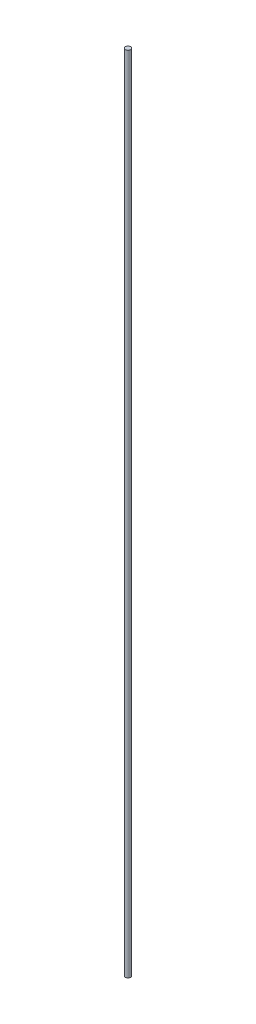
ISO-10303-21;
HEADER;
FILE_DESCRIPTION(('STEP AP214'),'2;1');
FILE_NAME('part.step','',(''),(''),'','','');
FILE_SCHEMA(('AUTOMOTIVE_DESIGN { 1 0 10303 214 1 1 1 1 }'));
ENDSEC;
DATA;
#1=APPLICATION_CONTEXT('core data for automotive mechanical design processes');
#2=APPLICATION_PROTOCOL_DEFINITION('international standard','automotive_design',2000,#1);
#3=PRODUCT_CONTEXT('',#1,'mechanical');
#4=PRODUCT('Part','Part','',(#3));
#5=PRODUCT_RELATED_PRODUCT_CATEGORY('part','',(#4));
#6=PRODUCT_DEFINITION_FORMATION('','',#4);
#7=PRODUCT_DEFINITION_CONTEXT('part definition',#1,'design');
#8=PRODUCT_DEFINITION('design','',#6,#7);
#9=PRODUCT_DEFINITION_SHAPE('','',#8);
#10=(LENGTH_UNIT() NAMED_UNIT(*) SI_UNIT(.MILLI.,.METRE.));
#11=(NAMED_UNIT(*) PLANE_ANGLE_UNIT() SI_UNIT($,.RADIAN.));
#12=(NAMED_UNIT(*) SI_UNIT($,.STERADIAN.) SOLID_ANGLE_UNIT());
#13=UNCERTAINTY_MEASURE_WITH_UNIT(LENGTH_MEASURE(1.E-05),#10,'distance_accuracy_value','');
#14=(GEOMETRIC_REPRESENTATION_CONTEXT(3) GLOBAL_UNCERTAINTY_ASSIGNED_CONTEXT((#13)) GLOBAL_UNIT_ASSIGNED_CONTEXT((#10,
#11,#12)) REPRESENTATION_CONTEXT('',''));
#15=CARTESIAN_POINT('',(0.,0.,0.));
#16=DIRECTION('',(0.,0.,1.));
#17=DIRECTION('',(1.,0.,0.));
#18=AXIS2_PLACEMENT_3D('',#15,#16,#17);
#19=CARTESIAN_POINT('',(0.,1219.2,0.));
#20=DIRECTION('',(0.,-1.,0.));
#21=DIRECTION('',(0.,0.,-1.));
#22=AXIS2_PLACEMENT_3D('',#19,#20,#21);
#23=CYLINDRICAL_SURFACE('',#22,3.96875);
#24=CARTESIAN_POINT('',(0.,1219.2,0.));
#25=DIRECTION('',(0.,1.,0.));
#26=DIRECTION('',(0.,0.,1.));
#27=AXIS2_PLACEMENT_3D('',#24,#25,#26);
#28=CIRCLE('',#27,3.96875);
#29=CARTESIAN_POINT('',(0.,1219.2,-3.96875));
#30=VERTEX_POINT('',#29);
#31=EDGE_CURVE('E12',#30,#30,#28,.T.);
#32=CARTESIAN_POINT('',(0.,0.,0.));
#33=DIRECTION('',(0.,1.,0.));
#34=DIRECTION('',(0.,0.,1.));
#35=AXIS2_PLACEMENT_3D('',#32,#33,#34);
#36=CIRCLE('',#35,3.96875);
#37=CARTESIAN_POINT('',(0.,0.,-3.96875));
#38=VERTEX_POINT('',#37);
#39=EDGE_CURVE('E43',#38,#38,#36,.T.);
#40=CARTESIAN_POINT('',(0.,1219.2,-3.96875));
#41=CARTESIAN_POINT('',(0.,1206.5,-3.96875));
#42=CARTESIAN_POINT('',(0.,1193.8,-3.96875));
#43=CARTESIAN_POINT('',(0.,1168.4,-3.96875));
#44=CARTESIAN_POINT('',(0.,1155.7,-3.96875));
#45=CARTESIAN_POINT('',(0.,1130.3,-3.96875));
#46=CARTESIAN_POINT('',(0.,1117.6,-3.96875));
#47=CARTESIAN_POINT('',(0.,1092.2,-3.96875));
#48=CARTESIAN_POINT('',(0.,1079.5,-3.96875));
#49=CARTESIAN_POINT('',(0.,1054.1,-3.96875));
#50=CARTESIAN_POINT('',(0.,1041.4,-3.96875));
#51=CARTESIAN_POINT('',(0.,1016.,-3.96875));
#52=CARTESIAN_POINT('',(0.,1003.3,-3.96875));
#53=CARTESIAN_POINT('',(0.,977.9,-3.96875));
#54=CARTESIAN_POINT('',(0.,965.2,-3.96875));
#55=CARTESIAN_POINT('',(0.,939.8,-3.96875));
#56=CARTESIAN_POINT('',(0.,927.1,-3.96875));
#57=CARTESIAN_POINT('',(0.,901.7,-3.96875));
#58=CARTESIAN_POINT('',(0.,889.,-3.96875));
#59=CARTESIAN_POINT('',(0.,863.6,-3.96875));
#60=CARTESIAN_POINT('',(0.,850.9,-3.96875));
#61=CARTESIAN_POINT('',(0.,825.5,-3.96875));
#62=CARTESIAN_POINT('',(0.,812.8,-3.96875));
#63=CARTESIAN_POINT('',(0.,787.4,-3.96875));
#64=CARTESIAN_POINT('',(0.,774.7,-3.96875));
#65=CARTESIAN_POINT('',(0.,749.3,-3.96875));
#66=CARTESIAN_POINT('',(0.,736.6,-3.96875));
#67=CARTESIAN_POINT('',(0.,711.2,-3.96875));
#68=CARTESIAN_POINT('',(0.,698.5,-3.96875));
#69=CARTESIAN_POINT('',(0.,673.1,-3.96875));
#70=CARTESIAN_POINT('',(0.,660.4,-3.96875));
#71=CARTESIAN_POINT('',(0.,635.,-3.96875));
#72=CARTESIAN_POINT('',(0.,622.3,-3.96875));
#73=CARTESIAN_POINT('',(0.,596.9,-3.96875));
#74=CARTESIAN_POINT('',(0.,584.2,-3.96875));
#75=CARTESIAN_POINT('',(0.,558.8,-3.96875));
#76=CARTESIAN_POINT('',(0.,546.1,-3.96875));
#77=CARTESIAN_POINT('',(0.,520.7,-3.96875));
#78=CARTESIAN_POINT('',(0.,508.,-3.96875));
#79=CARTESIAN_POINT('',(0.,482.6,-3.96875));
#80=CARTESIAN_POINT('',(0.,469.9,-3.96875));
#81=CARTESIAN_POINT('',(0.,444.5,-3.96875));
#82=CARTESIAN_POINT('',(0.,431.8,-3.96875));
#83=CARTESIAN_POINT('',(0.,406.4,-3.96875));
#84=CARTESIAN_POINT('',(0.,393.7,-3.96875));
#85=CARTESIAN_POINT('',(0.,368.3,-3.96875));
#86=CARTESIAN_POINT('',(0.,355.6,-3.96875));
#87=CARTESIAN_POINT('',(0.,330.2,-3.96875));
#88=CARTESIAN_POINT('',(0.,317.5,-3.96875));
#89=CARTESIAN_POINT('',(0.,292.1,-3.96875));
#90=CARTESIAN_POINT('',(0.,279.4,-3.96875));
#91=CARTESIAN_POINT('',(0.,254.,-3.96875));
#92=CARTESIAN_POINT('',(0.,241.3,-3.96875));
#93=CARTESIAN_POINT('',(0.,215.9,-3.96875));
#94=CARTESIAN_POINT('',(0.,203.2,-3.96875));
#95=CARTESIAN_POINT('',(0.,177.8,-3.96875));
#96=CARTESIAN_POINT('',(0.,165.1,-3.96875));
#97=CARTESIAN_POINT('',(0.,139.7,-3.96875));
#98=CARTESIAN_POINT('',(0.,127.,-3.96875));
#99=CARTESIAN_POINT('',(0.,101.6,-3.96875));
#100=CARTESIAN_POINT('',(0.,88.9,-3.96875));
#101=CARTESIAN_POINT('',(0.,63.5,-3.96875));
#102=CARTESIAN_POINT('',(0.,50.8,-3.96875));
#103=CARTESIAN_POINT('',(0.,25.4,-3.96875));
#104=CARTESIAN_POINT('',(0.,12.7,-3.96875));
#105=CARTESIAN_POINT('',(0.,0.,-3.96875));
#106=B_SPLINE_CURVE_WITH_KNOTS('',3,(#40,#41,#42,#43,#44,#45,#46,#47,#48,#49,#50,#51,#52,#53,
#54,#55,#56,#57,#58,#59,#60,#61,#62,#63,#64,#65,#66,#67,#68,#69,#70,#71,#72,#73,#74,#75,#76,#77,
#78,#79,#80,#81,#82,#83,#84,#85,#86,#87,#88,#89,#90,#91,#92,#93,#94,#95,#96,#97,#98,#99,#100,
#101,#102,#103,#104,#105),.UNSPECIFIED.,.F.,.F.,(4,2,2,2,2,2,2,2,2,2,2,2,2,2,2,2,2,2,2,2,2,2,2,
2,2,2,2,2,2,2,2,2,4),(0.,38.1,76.2,114.3,152.4,190.5,228.6,266.7,304.8,342.9,381.,419.1,457.2,
495.3,533.4,571.5,609.6,647.7,685.8,723.9,762.,800.1,838.2,876.3,914.4,952.5,990.6,1028.7,
1066.8,1104.9,1143.,1181.1,1219.2),.UNSPECIFIED.);
#107=EDGE_CURVE('BSEAM40',#30,#38,#106,.T.);
#108=ORIENTED_EDGE('',*,*,#31,.F.);
#109=ORIENTED_EDGE('',*,*,#39,.T.);
#110=ORIENTED_EDGE('',*,*,#107,.T.);
#111=ORIENTED_EDGE('',*,*,#107,.F.);
#112=EDGE_LOOP('',(#108,#110,#109,#111));
#113=FACE_BOUND('',#112,.T.);
#114=ADVANCED_FACE('F40',(#113),#23,.T.);
#115=CARTESIAN_POINT('',(0.,1219.2,0.));
#116=DIRECTION('',(0.,1.,0.));
#117=DIRECTION('',(0.,0.,1.));
#118=AXIS2_PLACEMENT_3D('',#115,#116,#117);
#119=PLANE('',#118);
#120=ORIENTED_EDGE('',*,*,#31,.T.);
#121=EDGE_LOOP('',(#120));
#122=FACE_BOUND('',#121,.T.);
#123=ADVANCED_FACE('F55',(#122),#119,.T.);
#124=CARTESIAN_POINT('',(0.,0.,0.));
#125=DIRECTION('',(0.,1.,0.));
#126=DIRECTION('',(0.,0.,1.));
#127=AXIS2_PLACEMENT_3D('',#124,#125,#126);
#128=PLANE('',#127);
#129=ORIENTED_EDGE('',*,*,#39,.F.);
#130=EDGE_LOOP('',(#129));
#131=FACE_BOUND('',#130,.T.);
#132=ADVANCED_FACE('F53',(#131),#128,.F.);
#133=CLOSED_SHELL('',(#114,#123,#132));
#134=MANIFOLD_SOLID_BREP('B2',#133);
#135=ADVANCED_BREP_SHAPE_REPRESENTATION('',(#18,#134),#14);
#136=SHAPE_DEFINITION_REPRESENTATION(#9,#135);
ENDSEC;
END-ISO-10303-21;
